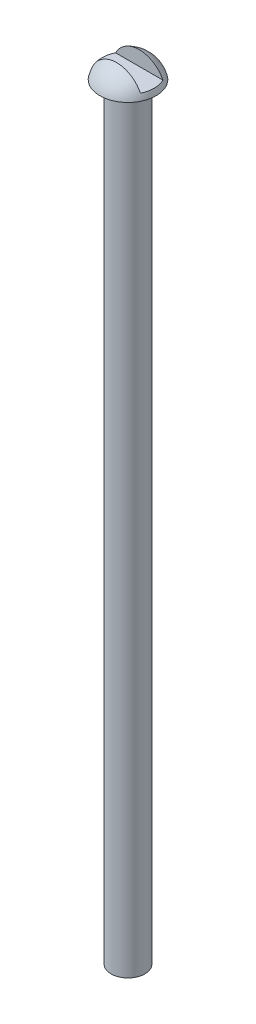
ISO-10303-21;
HEADER;
FILE_DESCRIPTION(('STEP AP214'),'2;1');
FILE_NAME('part.step','',(''),(''),'','','');
FILE_SCHEMA(('AUTOMOTIVE_DESIGN { 1 0 10303 214 1 1 1 1 }'));
ENDSEC;
DATA;
#1=APPLICATION_CONTEXT('core data for automotive mechanical design processes');
#2=APPLICATION_PROTOCOL_DEFINITION('international standard','automotive_design',2000,#1);
#3=PRODUCT_CONTEXT('',#1,'mechanical');
#4=PRODUCT('Part','Part','',(#3));
#5=PRODUCT_RELATED_PRODUCT_CATEGORY('part','',(#4));
#6=PRODUCT_DEFINITION_FORMATION('','',#4);
#7=PRODUCT_DEFINITION_CONTEXT('part definition',#1,'design');
#8=PRODUCT_DEFINITION('design','',#6,#7);
#9=PRODUCT_DEFINITION_SHAPE('','',#8);
#10=(LENGTH_UNIT() NAMED_UNIT(*) SI_UNIT(.MILLI.,.METRE.));
#11=(NAMED_UNIT(*) PLANE_ANGLE_UNIT() SI_UNIT($,.RADIAN.));
#12=(NAMED_UNIT(*) SI_UNIT($,.STERADIAN.) SOLID_ANGLE_UNIT());
#13=UNCERTAINTY_MEASURE_WITH_UNIT(LENGTH_MEASURE(1.E-05),#10,'distance_accuracy_value','');
#14=(GEOMETRIC_REPRESENTATION_CONTEXT(3) GLOBAL_UNCERTAINTY_ASSIGNED_CONTEXT((#13)) GLOBAL_UNIT_ASSIGNED_CONTEXT((#10,
#11,#12)) REPRESENTATION_CONTEXT('',''));
#15=CARTESIAN_POINT('',(0.,0.,0.));
#16=DIRECTION('',(0.,0.,1.));
#17=DIRECTION('',(1.,0.,0.));
#18=AXIS2_PLACEMENT_3D('',#15,#16,#17);
#19=CARTESIAN_POINT('',(0.,67.4375,0.));
#20=DIRECTION('',(0.,-1.,0.));
#21=DIRECTION('',(1.,0.,0.));
#22=AXIS2_PLACEMENT_3D('',#19,#20,#21);
#23=SPHERICAL_SURFACE('',#22,2.5625);
#24=CARTESIAN_POINT('',(0.,68.,0.));
#25=DIRECTION('',(0.,-1.,0.));
#26=DIRECTION('',(0.,0.,-1.));
#27=AXIS2_PLACEMENT_3D('',#24,#25,#26);
#28=CIRCLE('',#27,2.5);
#29=CARTESIAN_POINT('',(0.,68.,-2.5));
#30=VERTEX_POINT('',#29);
#31=EDGE_CURVE('E67',#30,#30,#28,.T.);
#32=ORIENTED_EDGE('',*,*,#31,.F.);
#33=EDGE_LOOP('',(#32));
#34=FACE_BOUND('',#33,.T.);
#35=CARTESIAN_POINT('',(0.,67.4375,1.));
#36=DIRECTION('',(0.,0.,1.));
#37=DIRECTION('',(1.,0.,0.));
#38=AXIS2_PLACEMENT_3D('',#35,#36,#37);
#39=CIRCLE('',#38,2.35932326102211);
#40=CARTESIAN_POINT('',(-2.10653744329409,68.5,1.));
#41=VERTEX_POINT('',#40);
#42=CARTESIAN_POINT('',(2.10653744329409,68.5,1.));
#43=VERTEX_POINT('',#42);
#44=EDGE_CURVE('E65',#41,#43,#39,.F.);
#45=ORIENTED_EDGE('',*,*,#44,.F.);
#46=CARTESIAN_POINT('',(0.,68.5,0.));
#47=DIRECTION('',(0.,1.,0.));
#48=DIRECTION('',(0.,0.,1.));
#49=AXIS2_PLACEMENT_3D('',#46,#47,#48);
#50=CIRCLE('',#49,2.3318447632722);
#51=CARTESIAN_POINT('',(-2.10653744329409,68.5,-1.));
#52=VERTEX_POINT('',#51);
#53=EDGE_CURVE('E11',#41,#52,#50,.F.);
#54=ORIENTED_EDGE('',*,*,#53,.T.);
#55=CARTESIAN_POINT('',(0.,67.4375,-1.));
#56=DIRECTION('',(0.,0.,-1.));
#57=DIRECTION('',(-1.,0.,0.));
#58=AXIS2_PLACEMENT_3D('',#55,#56,#57);
#59=CIRCLE('',#58,2.35932326102211);
#60=CARTESIAN_POINT('',(2.10653744329409,68.5,-1.));
#61=VERTEX_POINT('',#60);
#62=EDGE_CURVE('E35',#61,#52,#59,.F.);
#63=ORIENTED_EDGE('',*,*,#62,.F.);
#64=EDGE_CURVE('E41',#61,#43,#50,.F.);
#65=ORIENTED_EDGE('',*,*,#64,.T.);
#66=EDGE_LOOP('',(#45,#54,#63,#65));
#67=FACE_BOUND('',#66,.T.);
#68=ADVANCED_FACE('F32',(#34,#67),#23,.T.);
#69=CARTESIAN_POINT('',(2.5,68.,0.));
#70=DIRECTION('',(0.,-1.,0.));
#71=DIRECTION('',(0.,0.,-1.));
#72=AXIS2_PLACEMENT_3D('',#69,#70,#71);
#73=PLANE('',#72);
#74=ORIENTED_EDGE('',*,*,#31,.T.);
#75=EDGE_LOOP('',(#74));
#76=FACE_BOUND('',#75,.T.);
#77=CARTESIAN_POINT('',(0.,68.,0.));
#78=DIRECTION('',(0.,-1.,0.));
#79=DIRECTION('',(0.,0.,-1.));
#80=AXIS2_PLACEMENT_3D('',#77,#78,#79);
#81=CIRCLE('',#80,1.49999999999999);
#82=CARTESIAN_POINT('',(0.,68.,-1.49999999999999));
#83=VERTEX_POINT('',#82);
#84=EDGE_CURVE('E71',#83,#83,#81,.T.);
#85=ORIENTED_EDGE('',*,*,#84,.F.);
#86=EDGE_LOOP('',(#85));
#87=FACE_BOUND('',#86,.T.);
#88=ADVANCED_FACE('F92',(#76,#87),#73,.T.);
#89=CARTESIAN_POINT('',(0.,0.,0.));
#90=DIRECTION('',(0.,-1.,0.));
#91=DIRECTION('',(0.,0.,-1.));
#92=AXIS2_PLACEMENT_3D('',#89,#90,#91);
#93=CYLINDRICAL_SURFACE('',#92,1.5);
#94=ORIENTED_EDGE('',*,*,#84,.T.);
#95=EDGE_LOOP('',(#94));
#96=FACE_BOUND('',#95,.T.);
#97=CARTESIAN_POINT('',(0.,0.,0.));
#98=DIRECTION('',(0.,-1.,0.));
#99=DIRECTION('',(0.,0.,-1.));
#100=AXIS2_PLACEMENT_3D('',#97,#98,#99);
#101=CIRCLE('',#100,1.5);
#102=CARTESIAN_POINT('',(0.,0.,-1.5));
#103=VERTEX_POINT('',#102);
#104=EDGE_CURVE('E74',#103,#103,#101,.T.);
#105=ORIENTED_EDGE('',*,*,#104,.F.);
#106=EDGE_LOOP('',(#105));
#107=FACE_BOUND('',#106,.T.);
#108=ADVANCED_FACE('F87',(#96,#107),#93,.T.);
#109=CARTESIAN_POINT('',(1.5,0.,0.));
#110=DIRECTION('',(0.,-1.,0.));
#111=DIRECTION('',(0.,0.,-1.));
#112=AXIS2_PLACEMENT_3D('',#109,#110,#111);
#113=PLANE('',#112);
#114=ORIENTED_EDGE('',*,*,#104,.T.);
#115=EDGE_LOOP('',(#114));
#116=FACE_BOUND('',#115,.T.);
#117=ADVANCED_FACE('F80',(#116),#113,.T.);
#118=CARTESIAN_POINT('',(2.5,78.5,-1.));
#119=DIRECTION('',(0.,0.,-1.));
#120=DIRECTION('',(-1.,0.,0.));
#121=AXIS2_PLACEMENT_3D('',#118,#119,#120);
#122=PLANE('',#121);
#123=ORIENTED_EDGE('',*,*,#62,.T.);
#124=DIRECTION('',(1.,0.,0.));
#125=VECTOR('',#124,1.);
#126=CARTESIAN_POINT('',(2.5,68.5,-1.));
#127=LINE('',#126,#125);
#128=EDGE_CURVE('E59',#52,#61,#127,.T.);
#129=ORIENTED_EDGE('',*,*,#128,.T.);
#130=EDGE_LOOP('',(#123,#129));
#131=FACE_BOUND('',#130,.T.);
#132=ADVANCED_FACE('F78',(#131),#122,.F.);
#133=CARTESIAN_POINT('',(2.5,78.5,1.));
#134=DIRECTION('',(0.,0.,1.));
#135=DIRECTION('',(1.,0.,0.));
#136=AXIS2_PLACEMENT_3D('',#133,#134,#135);
#137=PLANE('',#136);
#138=ORIENTED_EDGE('',*,*,#44,.T.);
#139=DIRECTION('',(-1.,0.,0.));
#140=VECTOR('',#139,1.);
#141=CARTESIAN_POINT('',(2.5,68.5,1.));
#142=LINE('',#141,#140);
#143=EDGE_CURVE('E48',#43,#41,#142,.T.);
#144=ORIENTED_EDGE('',*,*,#143,.T.);
#145=EDGE_LOOP('',(#138,#144));
#146=FACE_BOUND('',#145,.T.);
#147=ADVANCED_FACE('F64',(#146),#137,.F.);
#148=CARTESIAN_POINT('',(2.5,68.5,0.));
#149=DIRECTION('',(0.,1.,0.));
#150=DIRECTION('',(0.,0.,1.));
#151=AXIS2_PLACEMENT_3D('',#148,#149,#150);
#152=PLANE('',#151);
#153=ORIENTED_EDGE('',*,*,#143,.F.);
#154=ORIENTED_EDGE('',*,*,#64,.F.);
#155=ORIENTED_EDGE('',*,*,#128,.F.);
#156=ORIENTED_EDGE('',*,*,#53,.F.);
#157=EDGE_LOOP('',(#153,#154,#155,#156));
#158=FACE_BOUND('',#157,.T.);
#159=ADVANCED_FACE('F58',(#158),#152,.T.);
#160=CLOSED_SHELL('',(#68,#88,#108,#117,#132,#147,#159));
#161=MANIFOLD_SOLID_BREP('B2',#160);
#162=ADVANCED_BREP_SHAPE_REPRESENTATION('',(#18,#161),#14);
#163=SHAPE_DEFINITION_REPRESENTATION(#9,#162);
ENDSEC;
END-ISO-10303-21;
